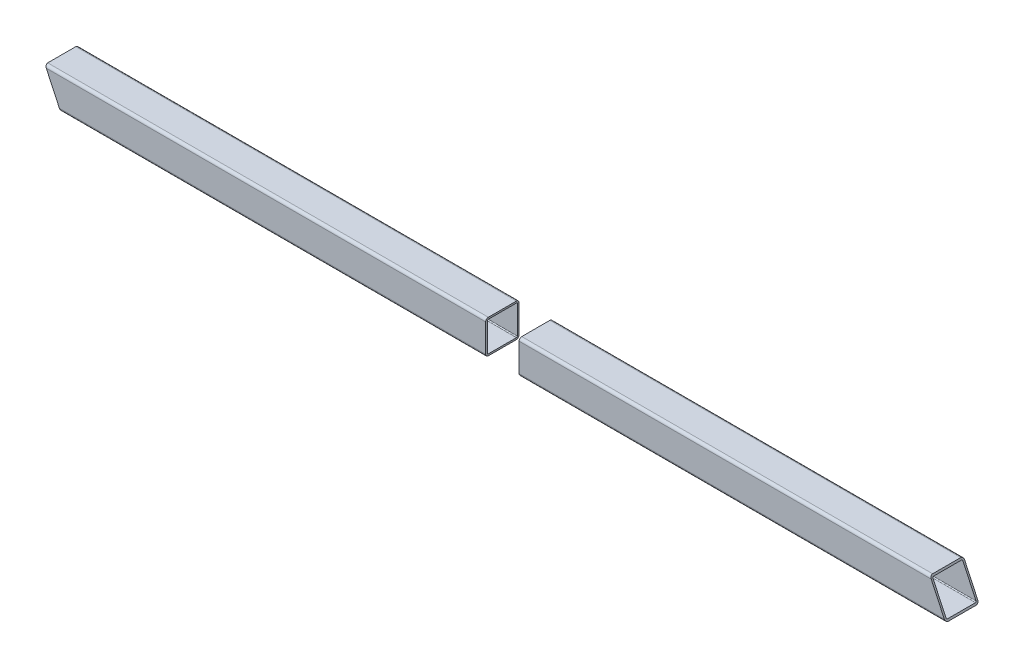
ISO-10303-21;
HEADER;
FILE_DESCRIPTION(('STEP AP214'),'2;1');
FILE_NAME('part.step','',(''),(''),'','','');
FILE_SCHEMA(('AUTOMOTIVE_DESIGN { 1 0 10303 214 1 1 1 1 }'));
ENDSEC;
DATA;
#1=APPLICATION_CONTEXT('core data for automotive mechanical design processes');
#2=APPLICATION_PROTOCOL_DEFINITION('international standard','automotive_design',2000,#1);
#3=PRODUCT_CONTEXT('',#1,'mechanical');
#4=PRODUCT('Part','Part','',(#3));
#5=PRODUCT_RELATED_PRODUCT_CATEGORY('part','',(#4));
#6=PRODUCT_DEFINITION_FORMATION('','',#4);
#7=PRODUCT_DEFINITION_CONTEXT('part definition',#1,'design');
#8=PRODUCT_DEFINITION('design','',#6,#7);
#9=PRODUCT_DEFINITION_SHAPE('','',#8);
#10=(LENGTH_UNIT() NAMED_UNIT(*) SI_UNIT(.MILLI.,.METRE.));
#11=(NAMED_UNIT(*) PLANE_ANGLE_UNIT() SI_UNIT($,.RADIAN.));
#12=(NAMED_UNIT(*) SI_UNIT($,.STERADIAN.) SOLID_ANGLE_UNIT());
#13=UNCERTAINTY_MEASURE_WITH_UNIT(LENGTH_MEASURE(1.E-05),#10,'distance_accuracy_value','');
#14=(GEOMETRIC_REPRESENTATION_CONTEXT(3) GLOBAL_UNCERTAINTY_ASSIGNED_CONTEXT((#13)) GLOBAL_UNIT_ASSIGNED_CONTEXT((#10,
#11,#12)) REPRESENTATION_CONTEXT('',''));
#15=CARTESIAN_POINT('',(0.,0.,0.));
#16=DIRECTION('',(0.,0.,1.));
#17=DIRECTION('',(1.,0.,0.));
#18=AXIS2_PLACEMENT_3D('',#15,#16,#17);
#19=CARTESIAN_POINT('',(393.7,10.1854,21.209));
#20=DIRECTION('',(0.,1.,0.));
#21=DIRECTION('',(0.,0.,1.));
#22=AXIS2_PLACEMENT_3D('',#19,#20,#21);
#23=PLANE('',#22);
#24=DIRECTION('',(0.,0.,1.));
#25=VECTOR('',#24,1.);
#26=CARTESIAN_POINT('',(341.923747380889,10.1854,21.209));
#27=LINE('',#26,#25);
#28=CARTESIAN_POINT('',(341.923747380889,10.1854,10.541));
#29=VERTEX_POINT('',#28);
#30=CARTESIAN_POINT('',(341.923747380889,10.1854,21.209));
#31=VERTEX_POINT('',#30);
#32=EDGE_CURVE('E226',#29,#31,#27,.T.);
#33=ORIENTED_EDGE('',*,*,#32,.F.);
#34=DIRECTION('',(-1.,0.,0.));
#35=VECTOR('',#34,1.);
#36=CARTESIAN_POINT('',(393.7,10.1854,10.541));
#37=LINE('',#36,#35);
#38=CARTESIAN_POINT('',(180.161106520746,10.1854,10.541));
#39=VERTEX_POINT('',#38);
#40=EDGE_CURVE('E62',#29,#39,#37,.T.);
#41=ORIENTED_EDGE('',*,*,#40,.T.);
#42=DIRECTION('',(0.,0.,-1.));
#43=VECTOR('',#42,1.);
#44=CARTESIAN_POINT('',(180.161106520746,10.1854,21.209));
#45=LINE('',#44,#43);
#46=CARTESIAN_POINT('',(180.161106520746,10.1854,21.209));
#47=VERTEX_POINT('',#46);
#48=EDGE_CURVE('E223',#47,#39,#45,.T.);
#49=ORIENTED_EDGE('',*,*,#48,.F.);
#50=DIRECTION('',(-1.,0.,0.));
#51=VECTOR('',#50,1.);
#52=CARTESIAN_POINT('',(393.7,10.1854,21.209));
#53=LINE('',#52,#51);
#54=EDGE_CURVE('E212',#31,#47,#53,.T.);
#55=ORIENTED_EDGE('',*,*,#54,.F.);
#56=EDGE_LOOP('',(#33,#41,#49,#55));
#57=FACE_BOUND('',#56,.T.);
#58=ADVANCED_FACE('F58',(#57),#23,.T.);
#59=CARTESIAN_POINT('',(393.7,10.541,21.209));
#60=DIRECTION('',(-1.,0.,0.));
#61=DIRECTION('',(0.,-1.,0.));
#62=AXIS2_PLACEMENT_3D('',#59,#60,#61);
#63=CYLINDRICAL_SURFACE('',#62,0.355600000000001);
#64=CARTESIAN_POINT('',(341.757928377651,10.5409999999959,21.209));
#65=DIRECTION('',(-0.906307787036652,-0.422618261740695,0.));
#66=DIRECTION('',(-0.422618261740695,0.906307787036652,0.));
#67=AXIS2_PLACEMENT_3D('',#64,#65,#66);
#68=ELLIPSE('',#67,0.392361187983048,0.355600000000001);
#69=CARTESIAN_POINT('',(341.757928377649,10.541,21.5646));
#70=VERTEX_POINT('',#69);
#71=EDGE_CURVE('E255',#31,#70,#68,.T.);
#72=ORIENTED_EDGE('',*,*,#71,.F.);
#73=ORIENTED_EDGE('',*,*,#54,.T.);
#74=CARTESIAN_POINT('',(180.161106520746,10.5409999999833,21.209));
#75=DIRECTION('',(1.,0.,0.));
#76=DIRECTION('',(0.,0.,-1.));
#77=AXIS2_PLACEMENT_3D('',#74,#75,#76);
#78=CIRCLE('',#77,0.355600000000001);
#79=CARTESIAN_POINT('',(180.161106520746,10.541,21.5646));
#80=VERTEX_POINT('',#79);
#81=EDGE_CURVE('E269',#80,#47,#78,.T.);
#82=ORIENTED_EDGE('',*,*,#81,.F.);
#83=DIRECTION('',(-1.,0.,0.));
#84=VECTOR('',#83,1.);
#85=CARTESIAN_POINT('',(393.7,10.541,21.5646));
#86=LINE('',#85,#84);
#87=EDGE_CURVE('E210',#70,#80,#86,.T.);
#88=ORIENTED_EDGE('',*,*,#87,.F.);
#89=EDGE_LOOP('',(#72,#73,#82,#88));
#90=FACE_BOUND('',#89,.T.);
#91=ADVANCED_FACE('F268',(#90),#63,.F.);
#92=CARTESIAN_POINT('',(393.7,21.209,21.5646));
#93=DIRECTION('',(0.,0.,-1.));
#94=DIRECTION('',(-1.,0.,0.));
#95=AXIS2_PLACEMENT_3D('',#92,#93,#94);
#96=PLANE('',#95);
#97=DIRECTION('',(-0.422618261740695,0.906307787036652,0.));
#98=VECTOR('',#97,1.);
#99=CARTESIAN_POINT('',(346.949023099079,-0.591338555126605,21.5646));
#100=LINE('',#99,#98);
#101=CARTESIAN_POINT('',(336.783358280452,21.209,21.5646));
#102=VERTEX_POINT('',#101);
#103=EDGE_CURVE('E258',#70,#102,#100,.T.);
#104=ORIENTED_EDGE('',*,*,#103,.F.);
#105=ORIENTED_EDGE('',*,*,#87,.T.);
#106=DIRECTION('',(0.,-1.,0.));
#107=VECTOR('',#106,1.);
#108=CARTESIAN_POINT('',(180.161106520746,21.209,21.5646));
#109=LINE('',#108,#107);
#110=CARTESIAN_POINT('',(180.161106520746,21.209,21.5646));
#111=VERTEX_POINT('',#110);
#112=EDGE_CURVE('E271',#111,#80,#109,.T.);
#113=ORIENTED_EDGE('',*,*,#112,.F.);
#114=DIRECTION('',(-1.,0.,0.));
#115=VECTOR('',#114,1.);
#116=CARTESIAN_POINT('',(393.7,21.209,21.5646));
#117=LINE('',#116,#115);
#118=EDGE_CURVE('E207',#102,#111,#117,.T.);
#119=ORIENTED_EDGE('',*,*,#118,.F.);
#120=EDGE_LOOP('',(#104,#105,#113,#119));
#121=FACE_BOUND('',#120,.T.);
#122=ADVANCED_FACE('F264',(#121),#96,.T.);
#123=CARTESIAN_POINT('',(393.7,21.209,21.209));
#124=DIRECTION('',(-1.,0.,0.));
#125=DIRECTION('',(0.,-1.,0.));
#126=AXIS2_PLACEMENT_3D('',#123,#124,#125);
#127=CYLINDRICAL_SURFACE('',#126,0.355600000000003);
#128=CARTESIAN_POINT('',(336.783358280454,21.2089999999956,21.209));
#129=DIRECTION('',(-0.906307787036652,-0.422618261740695,0.));
#130=DIRECTION('',(-0.422618261740695,0.906307787036652,0.));
#131=AXIS2_PLACEMENT_3D('',#128,#129,#130);
#132=ELLIPSE('',#131,0.39236118798305,0.355600000000003);
#133=CARTESIAN_POINT('',(336.617539277212,21.5646,21.209));
#134=VERTEX_POINT('',#133);
#135=EDGE_CURVE('E266',#102,#134,#132,.T.);
#136=ORIENTED_EDGE('',*,*,#135,.F.);
#137=ORIENTED_EDGE('',*,*,#118,.T.);
#138=CARTESIAN_POINT('',(180.161106520746,21.2089999999833,21.209));
#139=DIRECTION('',(1.,0.,0.));
#140=DIRECTION('',(0.,0.,-1.));
#141=AXIS2_PLACEMENT_3D('',#138,#139,#140);
#142=CIRCLE('',#141,0.355600000000003);
#143=CARTESIAN_POINT('',(180.161106520746,21.5645999999833,21.209));
#144=VERTEX_POINT('',#143);
#145=EDGE_CURVE('E274',#144,#111,#142,.T.);
#146=ORIENTED_EDGE('',*,*,#145,.F.);
#147=DIRECTION('',(-1.,0.,0.));
#148=VECTOR('',#147,1.);
#149=CARTESIAN_POINT('',(393.7,21.5646,21.209));
#150=LINE('',#149,#148);
#151=EDGE_CURVE('E204',#134,#144,#150,.T.);
#152=ORIENTED_EDGE('',*,*,#151,.F.);
#153=EDGE_LOOP('',(#136,#137,#146,#152));
#154=FACE_BOUND('',#153,.T.);
#155=ADVANCED_FACE('F319',(#154),#127,.F.);
#156=CARTESIAN_POINT('',(393.7,21.5646,10.541));
#157=DIRECTION('',(0.,-1.,0.));
#158=DIRECTION('',(0.,0.,-1.));
#159=AXIS2_PLACEMENT_3D('',#156,#157,#158);
#160=PLANE('',#159);
#161=DIRECTION('',(0.,0.,-1.));
#162=VECTOR('',#161,1.);
#163=CARTESIAN_POINT('',(336.617539277212,21.5646,10.541));
#164=LINE('',#163,#162);
#165=CARTESIAN_POINT('',(336.617539277212,21.5646,10.541));
#166=VERTEX_POINT('',#165);
#167=EDGE_CURVE('E302',#134,#166,#164,.T.);
#168=ORIENTED_EDGE('',*,*,#167,.F.);
#169=ORIENTED_EDGE('',*,*,#151,.T.);
#170=DIRECTION('',(0.,0.,1.));
#171=VECTOR('',#170,1.);
#172=CARTESIAN_POINT('',(180.161106520746,21.5646,10.541));
#173=LINE('',#172,#171);
#174=CARTESIAN_POINT('',(180.161106520746,21.5646,10.541));
#175=VERTEX_POINT('',#174);
#176=EDGE_CURVE('E314',#175,#144,#173,.T.);
#177=ORIENTED_EDGE('',*,*,#176,.F.);
#178=DIRECTION('',(-1.,0.,0.));
#179=VECTOR('',#178,1.);
#180=CARTESIAN_POINT('',(393.7,21.5646,10.541));
#181=LINE('',#180,#179);
#182=EDGE_CURVE('E201',#166,#175,#181,.T.);
#183=ORIENTED_EDGE('',*,*,#182,.F.);
#184=EDGE_LOOP('',(#168,#169,#177,#183));
#185=FACE_BOUND('',#184,.T.);
#186=ADVANCED_FACE('F324',(#185),#160,.T.);
#187=CARTESIAN_POINT('',(393.7,21.209,10.541));
#188=DIRECTION('',(-1.,0.,0.));
#189=DIRECTION('',(0.,-1.,0.));
#190=AXIS2_PLACEMENT_3D('',#187,#188,#189);
#191=CYLINDRICAL_SURFACE('',#190,0.3556);
#192=CARTESIAN_POINT('',(336.783358280454,21.2089999999956,10.541));
#193=DIRECTION('',(-0.906307787036652,-0.422618261740695,0.));
#194=DIRECTION('',(-0.422618261740695,0.906307787036652,0.));
#195=AXIS2_PLACEMENT_3D('',#192,#193,#194);
#196=ELLIPSE('',#195,0.392361187983047,0.3556);
#197=CARTESIAN_POINT('',(336.783358280452,21.209,10.1854));
#198=VERTEX_POINT('',#197);
#199=EDGE_CURVE('E300',#166,#198,#196,.T.);
#200=ORIENTED_EDGE('',*,*,#199,.F.);
#201=ORIENTED_EDGE('',*,*,#182,.T.);
#202=CARTESIAN_POINT('',(180.161106520746,21.2089999999833,10.541));
#203=DIRECTION('',(1.,0.,0.));
#204=DIRECTION('',(0.,0.,-1.));
#205=AXIS2_PLACEMENT_3D('',#202,#203,#204);
#206=CIRCLE('',#205,0.3556);
#207=CARTESIAN_POINT('',(180.161106520746,21.2089999999833,10.1854));
#208=VERTEX_POINT('',#207);
#209=EDGE_CURVE('E312',#208,#175,#206,.T.);
#210=ORIENTED_EDGE('',*,*,#209,.F.);
#211=DIRECTION('',(-1.,0.,0.));
#212=VECTOR('',#211,1.);
#213=CARTESIAN_POINT('',(393.7,21.209,10.1854));
#214=LINE('',#213,#212);
#215=EDGE_CURVE('E198',#198,#208,#214,.T.);
#216=ORIENTED_EDGE('',*,*,#215,.F.);
#217=EDGE_LOOP('',(#200,#201,#210,#216));
#218=FACE_BOUND('',#217,.T.);
#219=ADVANCED_FACE('F327',(#218),#191,.F.);
#220=CARTESIAN_POINT('',(393.7,10.541,10.1854));
#221=DIRECTION('',(0.,0.,1.));
#222=DIRECTION('',(1.,0.,0.));
#223=AXIS2_PLACEMENT_3D('',#220,#221,#222);
#224=PLANE('',#223);
#225=DIRECTION('',(0.422618261740695,-0.906307787036652,0.));
#226=VECTOR('',#225,1.);
#227=CARTESIAN_POINT('',(351.035104158676,-9.35396766519464,10.1854));
#228=LINE('',#227,#226);
#229=CARTESIAN_POINT('',(341.757928377649,10.541,10.1854));
#230=VERTEX_POINT('',#229);
#231=EDGE_CURVE('E287',#198,#230,#228,.T.);
#232=ORIENTED_EDGE('',*,*,#231,.F.);
#233=ORIENTED_EDGE('',*,*,#215,.T.);
#234=DIRECTION('',(0.,1.,0.));
#235=VECTOR('',#234,1.);
#236=CARTESIAN_POINT('',(180.161106520746,10.541,10.1854));
#237=LINE('',#236,#235);
#238=CARTESIAN_POINT('',(180.161106520746,10.541,10.1854));
#239=VERTEX_POINT('',#238);
#240=EDGE_CURVE('E310',#239,#208,#237,.T.);
#241=ORIENTED_EDGE('',*,*,#240,.F.);
#242=DIRECTION('',(-1.,0.,0.));
#243=VECTOR('',#242,1.);
#244=CARTESIAN_POINT('',(393.7,10.541,10.1854));
#245=LINE('',#244,#243);
#246=EDGE_CURVE('E194',#230,#239,#245,.T.);
#247=ORIENTED_EDGE('',*,*,#246,.F.);
#248=EDGE_LOOP('',(#232,#233,#241,#247));
#249=FACE_BOUND('',#248,.T.);
#250=ADVANCED_FACE('F331',(#249),#224,.T.);
#251=CARTESIAN_POINT('',(393.7,10.541,10.541));
#252=DIRECTION('',(-1.,0.,0.));
#253=DIRECTION('',(0.,-1.,0.));
#254=AXIS2_PLACEMENT_3D('',#251,#252,#253);
#255=CYLINDRICAL_SURFACE('',#254,0.3556);
#256=CARTESIAN_POINT('',(341.757928377651,10.5409999999959,10.541));
#257=DIRECTION('',(-0.906307787036652,-0.422618261740695,0.));
#258=DIRECTION('',(-0.422618261740695,0.906307787036652,0.));
#259=AXIS2_PLACEMENT_3D('',#256,#257,#258);
#260=ELLIPSE('',#259,0.392361187983047,0.3556);
#261=EDGE_CURVE('E162',#230,#29,#260,.T.);
#262=ORIENTED_EDGE('',*,*,#261,.F.);
#263=ORIENTED_EDGE('',*,*,#246,.T.);
#264=CARTESIAN_POINT('',(180.161106520746,10.5409999999833,10.541));
#265=DIRECTION('',(1.,0.,0.));
#266=DIRECTION('',(0.,0.,-1.));
#267=AXIS2_PLACEMENT_3D('',#264,#265,#266);
#268=CIRCLE('',#267,0.3556);
#269=EDGE_CURVE('E197',#39,#239,#268,.T.);
#270=ORIENTED_EDGE('',*,*,#269,.F.);
#271=ORIENTED_EDGE('',*,*,#40,.F.);
#272=EDGE_LOOP('',(#262,#263,#270,#271));
#273=FACE_BOUND('',#272,.T.);
#274=ADVANCED_FACE('F230',(#273),#255,.F.);
#275=CARTESIAN_POINT('',(180.161106520746,22.225,9.525));
#276=DIRECTION('',(1.,0.,0.));
#277=DIRECTION('',(0.,0.,-1.));
#278=AXIS2_PLACEMENT_3D('',#275,#276,#277);
#279=PLANE('',#278);
#280=ORIENTED_EDGE('',*,*,#269,.T.);
#281=ORIENTED_EDGE('',*,*,#240,.T.);
#282=ORIENTED_EDGE('',*,*,#209,.T.);
#283=ORIENTED_EDGE('',*,*,#176,.T.);
#284=ORIENTED_EDGE('',*,*,#145,.T.);
#285=ORIENTED_EDGE('',*,*,#112,.T.);
#286=ORIENTED_EDGE('',*,*,#81,.T.);
#287=ORIENTED_EDGE('',*,*,#48,.T.);
#288=EDGE_LOOP('',(#280,#281,#282,#283,#284,#285,#286,#287));
#289=FACE_BOUND('',#288,.T.);
#290=DIRECTION('',(0.,1.,0.));
#291=VECTOR('',#290,1.);
#292=CARTESIAN_POINT('',(180.161106520746,22.225,22.225));
#293=LINE('',#292,#291);
#294=CARTESIAN_POINT('',(180.161106520746,10.541,22.225));
#295=VERTEX_POINT('',#294);
#296=CARTESIAN_POINT('',(180.161106520746,21.209,22.225));
#297=VERTEX_POINT('',#296);
#298=EDGE_CURVE('E163',#295,#297,#293,.T.);
#299=ORIENTED_EDGE('',*,*,#298,.T.);
#300=CARTESIAN_POINT('',(180.161106520746,21.2089999999942,21.209));
#301=DIRECTION('',(1.,0.,0.));
#302=DIRECTION('',(0.,0.,-1.));
#303=AXIS2_PLACEMENT_3D('',#300,#301,#302);
#304=CIRCLE('',#303,1.016);
#305=CARTESIAN_POINT('',(180.161106520746,22.225,21.209));
#306=VERTEX_POINT('',#305);
#307=EDGE_CURVE('E185',#306,#297,#304,.T.);
#308=ORIENTED_EDGE('',*,*,#307,.F.);
#309=DIRECTION('',(0.,0.,1.));
#310=VECTOR('',#309,1.);
#311=CARTESIAN_POINT('',(180.161106520746,22.225,9.525));
#312=LINE('',#311,#310);
#313=CARTESIAN_POINT('',(180.161106520746,22.225,10.541));
#314=VERTEX_POINT('',#313);
#315=EDGE_CURVE('E184',#314,#306,#312,.T.);
#316=ORIENTED_EDGE('',*,*,#315,.F.);
#317=CARTESIAN_POINT('',(180.161106520746,21.2089999999942,10.541));
#318=DIRECTION('',(1.,0.,0.));
#319=DIRECTION('',(0.,0.,-1.));
#320=AXIS2_PLACEMENT_3D('',#317,#318,#319);
#321=CIRCLE('',#320,1.016);
#322=CARTESIAN_POINT('',(180.161106520746,21.208999999994,9.525));
#323=VERTEX_POINT('',#322);
#324=EDGE_CURVE('E179',#323,#314,#321,.T.);
#325=ORIENTED_EDGE('',*,*,#324,.F.);
#326=DIRECTION('',(0.,1.,0.));
#327=VECTOR('',#326,1.);
#328=CARTESIAN_POINT('',(180.161106520746,22.225,9.525));
#329=LINE('',#328,#327);
#330=CARTESIAN_POINT('',(180.161106520746,10.541,9.525));
#331=VERTEX_POINT('',#330);
#332=EDGE_CURVE('E148',#331,#323,#329,.T.);
#333=ORIENTED_EDGE('',*,*,#332,.F.);
#334=CARTESIAN_POINT('',(180.161106520746,10.5409999999942,10.541));
#335=DIRECTION('',(1.,0.,0.));
#336=DIRECTION('',(0.,0.,-1.));
#337=AXIS2_PLACEMENT_3D('',#334,#335,#336);
#338=CIRCLE('',#337,1.016);
#339=CARTESIAN_POINT('',(180.161106520746,9.52500000000006,10.541));
#340=VERTEX_POINT('',#339);
#341=EDGE_CURVE('E141',#340,#331,#338,.T.);
#342=ORIENTED_EDGE('',*,*,#341,.F.);
#343=DIRECTION('',(0.,0.,1.));
#344=VECTOR('',#343,1.);
#345=CARTESIAN_POINT('',(180.161106520746,9.52500000000006,9.525));
#346=LINE('',#345,#344);
#347=CARTESIAN_POINT('',(180.161106520746,9.52500000000006,21.209));
#348=VERTEX_POINT('',#347);
#349=EDGE_CURVE('E146',#340,#348,#346,.T.);
#350=ORIENTED_EDGE('',*,*,#349,.T.);
#351=CARTESIAN_POINT('',(180.161106520746,10.5409999999942,21.209));
#352=DIRECTION('',(1.,0.,0.));
#353=DIRECTION('',(0.,0.,-1.));
#354=AXIS2_PLACEMENT_3D('',#351,#352,#353);
#355=CIRCLE('',#354,1.016);
#356=EDGE_CURVE('E12',#295,#348,#355,.T.);
#357=ORIENTED_EDGE('',*,*,#356,.F.);
#358=EDGE_LOOP('',(#299,#308,#316,#325,#333,#342,#350,#357));
#359=FACE_BOUND('',#358,.T.);
#360=ADVANCED_FACE('F144',(#289,#359),#279,.F.);
#361=CARTESIAN_POINT('',(336.309589699766,22.225,9.525));
#362=DIRECTION('',(-0.906307787036652,-0.422618261740695,0.));
#363=DIRECTION('',(0.422618261740695,-0.906307787036652,0.));
#364=AXIS2_PLACEMENT_3D('',#361,#362,#363);
#365=PLANE('',#364);
#366=ORIENTED_EDGE('',*,*,#261,.T.);
#367=ORIENTED_EDGE('',*,*,#32,.T.);
#368=ORIENTED_EDGE('',*,*,#71,.T.);
#369=ORIENTED_EDGE('',*,*,#103,.T.);
#370=ORIENTED_EDGE('',*,*,#135,.T.);
#371=ORIENTED_EDGE('',*,*,#167,.T.);
#372=ORIENTED_EDGE('',*,*,#199,.T.);
#373=ORIENTED_EDGE('',*,*,#231,.T.);
#374=EDGE_LOOP('',(#366,#367,#368,#369,#370,#371,#372,#373));
#375=FACE_BOUND('',#374,.T.);
#376=DIRECTION('',(0.,0.,1.));
#377=VECTOR('',#376,1.);
#378=CARTESIAN_POINT('',(342.231696958335,9.525,9.525));
#379=LINE('',#378,#377);
#380=CARTESIAN_POINT('',(342.231696958336,9.52499999999859,10.541));
#381=VERTEX_POINT('',#380);
#382=CARTESIAN_POINT('',(342.231696958335,9.525,21.209));
#383=VERTEX_POINT('',#382);
#384=EDGE_CURVE('E153',#381,#383,#379,.T.);
#385=ORIENTED_EDGE('',*,*,#384,.F.);
#386=CARTESIAN_POINT('',(341.75792837765,10.5409999999986,10.541));
#387=DIRECTION('',(-0.906307787036652,-0.422618261740695,0.));
#388=DIRECTION('',(-0.422618261740695,0.906307787036652,0.));
#389=AXIS2_PLACEMENT_3D('',#386,#387,#388);
#390=ELLIPSE('',#389,1.12103196566587,1.016);
#391=CARTESIAN_POINT('',(341.757928377649,10.541,9.525));
#392=VERTEX_POINT('',#391);
#393=EDGE_CURVE('E167',#392,#381,#390,.T.);
#394=ORIENTED_EDGE('',*,*,#393,.F.);
#395=DIRECTION('',(0.422618261740695,-0.906307787036652,0.));
#396=VECTOR('',#395,1.);
#397=CARTESIAN_POINT('',(336.309589699766,22.225,9.525));
#398=LINE('',#397,#396);
#399=CARTESIAN_POINT('',(336.783358280453,21.2089999999984,9.525));
#400=VERTEX_POINT('',#399);
#401=EDGE_CURVE('E175',#400,#392,#398,.T.);
#402=ORIENTED_EDGE('',*,*,#401,.F.);
#403=CARTESIAN_POINT('',(336.783358280453,21.2089999999984,10.541));
#404=DIRECTION('',(-0.906307787036652,-0.422618261740695,0.));
#405=DIRECTION('',(-0.422618261740695,0.906307787036652,0.));
#406=AXIS2_PLACEMENT_3D('',#403,#404,#405);
#407=ELLIPSE('',#406,1.12103196566587,1.016);
#408=CARTESIAN_POINT('',(336.309589699766,22.225,10.541));
#409=VERTEX_POINT('',#408);
#410=EDGE_CURVE('E180',#409,#400,#407,.T.);
#411=ORIENTED_EDGE('',*,*,#410,.F.);
#412=DIRECTION('',(0.,0.,1.));
#413=VECTOR('',#412,1.);
#414=CARTESIAN_POINT('',(336.309589699766,22.225,9.525));
#415=LINE('',#414,#413);
#416=CARTESIAN_POINT('',(336.309589699767,22.2249999999984,21.209));
#417=VERTEX_POINT('',#416);
#418=EDGE_CURVE('E285',#409,#417,#415,.T.);
#419=ORIENTED_EDGE('',*,*,#418,.T.);
#420=CARTESIAN_POINT('',(336.783358280453,21.2089999999984,21.209));
#421=DIRECTION('',(-0.906307787036652,-0.422618261740695,0.));
#422=DIRECTION('',(-0.422618261740695,0.906307787036652,0.));
#423=AXIS2_PLACEMENT_3D('',#420,#421,#422);
#424=ELLIPSE('',#423,1.12103196566588,1.016);
#425=CARTESIAN_POINT('',(336.783358280452,21.209,22.225));
#426=VERTEX_POINT('',#425);
#427=EDGE_CURVE('E189',#426,#417,#424,.T.);
#428=ORIENTED_EDGE('',*,*,#427,.F.);
#429=DIRECTION('',(0.422618261740695,-0.906307787036652,0.));
#430=VECTOR('',#429,1.);
#431=CARTESIAN_POINT('',(336.309589699766,22.225,22.225));
#432=LINE('',#431,#430);
#433=CARTESIAN_POINT('',(341.757928377649,10.541,22.225));
#434=VERTEX_POINT('',#433);
#435=EDGE_CURVE('E193',#426,#434,#432,.T.);
#436=ORIENTED_EDGE('',*,*,#435,.T.);
#437=CARTESIAN_POINT('',(341.75792837765,10.5409999999986,21.209));
#438=DIRECTION('',(-0.906307787036652,-0.422618261740695,0.));
#439=DIRECTION('',(-0.422618261740695,0.906307787036652,0.));
#440=AXIS2_PLACEMENT_3D('',#437,#438,#439);
#441=ELLIPSE('',#440,1.12103196566587,1.016);
#442=EDGE_CURVE('E77',#383,#434,#441,.T.);
#443=ORIENTED_EDGE('',*,*,#442,.F.);
#444=EDGE_LOOP('',(#385,#394,#402,#411,#419,#428,#436,#443));
#445=FACE_BOUND('',#444,.T.);
#446=ADVANCED_FACE('F257',(#375,#445),#365,.F.);
#447=CARTESIAN_POINT('',(393.7,21.209,22.225));
#448=DIRECTION('',(0.,0.,-1.));
#449=DIRECTION('',(0.,1.,0.));
#450=AXIS2_PLACEMENT_3D('',#447,#448,#449);
#451=PLANE('',#450);
#452=DIRECTION('',(-1.,0.,0.));
#453=VECTOR('',#452,1.);
#454=CARTESIAN_POINT('',(393.7,10.541,22.225));
#455=LINE('',#454,#453);
#456=EDGE_CURVE('E68',#434,#295,#455,.T.);
#457=ORIENTED_EDGE('',*,*,#456,.F.);
#458=ORIENTED_EDGE('',*,*,#435,.F.);
#459=DIRECTION('',(-1.,0.,0.));
#460=VECTOR('',#459,1.);
#461=CARTESIAN_POINT('',(393.7,21.209,22.225));
#462=LINE('',#461,#460);
#463=EDGE_CURVE('E190',#426,#297,#462,.T.);
#464=ORIENTED_EDGE('',*,*,#463,.T.);
#465=ORIENTED_EDGE('',*,*,#298,.F.);
#466=EDGE_LOOP('',(#457,#458,#464,#465));
#467=FACE_BOUND('',#466,.T.);
#468=ADVANCED_FACE('F381',(#467),#451,.F.);
#469=CARTESIAN_POINT('',(393.7,21.209,21.209));
#470=DIRECTION('',(-1.,0.,0.));
#471=DIRECTION('',(0.,-1.,0.));
#472=AXIS2_PLACEMENT_3D('',#469,#470,#471);
#473=CYLINDRICAL_SURFACE('',#472,1.016);
#474=ORIENTED_EDGE('',*,*,#463,.F.);
#475=ORIENTED_EDGE('',*,*,#427,.T.);
#476=DIRECTION('',(-1.,0.,0.));
#477=VECTOR('',#476,1.);
#478=CARTESIAN_POINT('',(393.7,22.225,21.209));
#479=LINE('',#478,#477);
#480=EDGE_CURVE('E186',#417,#306,#479,.T.);
#481=ORIENTED_EDGE('',*,*,#480,.T.);
#482=ORIENTED_EDGE('',*,*,#307,.T.);
#483=EDGE_LOOP('',(#474,#475,#481,#482));
#484=FACE_BOUND('',#483,.T.);
#485=ADVANCED_FACE('F386',(#484),#473,.T.);
#486=CARTESIAN_POINT('',(393.7,22.225,10.541));
#487=DIRECTION('',(0.,-1.,0.));
#488=DIRECTION('',(0.,0.,-1.));
#489=AXIS2_PLACEMENT_3D('',#486,#487,#488);
#490=PLANE('',#489);
#491=ORIENTED_EDGE('',*,*,#480,.F.);
#492=ORIENTED_EDGE('',*,*,#418,.F.);
#493=DIRECTION('',(-1.,0.,0.));
#494=VECTOR('',#493,1.);
#495=CARTESIAN_POINT('',(393.7,22.225,10.541));
#496=LINE('',#495,#494);
#497=EDGE_CURVE('E181',#409,#314,#496,.T.);
#498=ORIENTED_EDGE('',*,*,#497,.T.);
#499=ORIENTED_EDGE('',*,*,#315,.T.);
#500=EDGE_LOOP('',(#491,#492,#498,#499));
#501=FACE_BOUND('',#500,.T.);
#502=ADVANCED_FACE('F397',(#501),#490,.F.);
#503=CARTESIAN_POINT('',(393.7,21.209,10.541));
#504=DIRECTION('',(-1.,0.,0.));
#505=DIRECTION('',(0.,-1.,0.));
#506=AXIS2_PLACEMENT_3D('',#503,#504,#505);
#507=CYLINDRICAL_SURFACE('',#506,1.016);
#508=ORIENTED_EDGE('',*,*,#497,.F.);
#509=ORIENTED_EDGE('',*,*,#410,.T.);
#510=DIRECTION('',(-1.,0.,0.));
#511=VECTOR('',#510,1.);
#512=CARTESIAN_POINT('',(393.7,21.209,9.525));
#513=LINE('',#512,#511);
#514=EDGE_CURVE('E176',#400,#323,#513,.T.);
#515=ORIENTED_EDGE('',*,*,#514,.T.);
#516=ORIENTED_EDGE('',*,*,#324,.T.);
#517=EDGE_LOOP('',(#508,#509,#515,#516));
#518=FACE_BOUND('',#517,.T.);
#519=ADVANCED_FACE('F407',(#518),#507,.T.);
#520=CARTESIAN_POINT('',(393.7,10.541,9.525));
#521=DIRECTION('',(0.,0.,1.));
#522=DIRECTION('',(1.,0.,0.));
#523=AXIS2_PLACEMENT_3D('',#520,#521,#522);
#524=PLANE('',#523);
#525=ORIENTED_EDGE('',*,*,#514,.F.);
#526=ORIENTED_EDGE('',*,*,#401,.T.);
#527=DIRECTION('',(-1.,0.,0.));
#528=VECTOR('',#527,1.);
#529=CARTESIAN_POINT('',(393.7,10.541,9.525));
#530=LINE('',#529,#528);
#531=EDGE_CURVE('E173',#392,#331,#530,.T.);
#532=ORIENTED_EDGE('',*,*,#531,.T.);
#533=ORIENTED_EDGE('',*,*,#332,.T.);
#534=EDGE_LOOP('',(#525,#526,#532,#533));
#535=FACE_BOUND('',#534,.T.);
#536=ADVANCED_FACE('F417',(#535),#524,.F.);
#537=CARTESIAN_POINT('',(393.7,10.541,10.541));
#538=DIRECTION('',(-1.,0.,0.));
#539=DIRECTION('',(0.,-1.,0.));
#540=AXIS2_PLACEMENT_3D('',#537,#538,#539);
#541=CYLINDRICAL_SURFACE('',#540,1.016);
#542=ORIENTED_EDGE('',*,*,#531,.F.);
#543=ORIENTED_EDGE('',*,*,#393,.T.);
#544=DIRECTION('',(-1.,0.,0.));
#545=VECTOR('',#544,1.);
#546=CARTESIAN_POINT('',(393.7,9.525,10.541));
#547=LINE('',#546,#545);
#548=EDGE_CURVE('E154',#381,#340,#547,.T.);
#549=ORIENTED_EDGE('',*,*,#548,.T.);
#550=ORIENTED_EDGE('',*,*,#341,.T.);
#551=EDGE_LOOP('',(#542,#543,#549,#550));
#552=FACE_BOUND('',#551,.T.);
#553=ADVANCED_FACE('F166',(#552),#541,.T.);
#554=CARTESIAN_POINT('',(393.7,9.525,21.209));
#555=DIRECTION('',(0.,1.,0.));
#556=DIRECTION('',(0.,0.,1.));
#557=AXIS2_PLACEMENT_3D('',#554,#555,#556);
#558=PLANE('',#557);
#559=ORIENTED_EDGE('',*,*,#548,.F.);
#560=ORIENTED_EDGE('',*,*,#384,.T.);
#561=DIRECTION('',(-1.,0.,0.));
#562=VECTOR('',#561,1.);
#563=CARTESIAN_POINT('',(393.7,9.525,21.209));
#564=LINE('',#563,#562);
#565=EDGE_CURVE('E161',#383,#348,#564,.T.);
#566=ORIENTED_EDGE('',*,*,#565,.T.);
#567=ORIENTED_EDGE('',*,*,#349,.F.);
#568=EDGE_LOOP('',(#559,#560,#566,#567));
#569=FACE_BOUND('',#568,.T.);
#570=ADVANCED_FACE('F159',(#569),#558,.F.);
#571=CARTESIAN_POINT('',(393.7,10.541,21.209));
#572=DIRECTION('',(-1.,0.,0.));
#573=DIRECTION('',(0.,-1.,0.));
#574=AXIS2_PLACEMENT_3D('',#571,#572,#573);
#575=CYLINDRICAL_SURFACE('',#574,1.016);
#576=ORIENTED_EDGE('',*,*,#565,.F.);
#577=ORIENTED_EDGE('',*,*,#442,.T.);
#578=ORIENTED_EDGE('',*,*,#456,.T.);
#579=ORIENTED_EDGE('',*,*,#356,.T.);
#580=EDGE_LOOP('',(#576,#577,#578,#579));
#581=FACE_BOUND('',#580,.T.);
#582=ADVANCED_FACE('F60',(#581),#575,.T.);
#583=CLOSED_SHELL('',(#58,#91,#122,#155,#186,#219,#250,#274,#360,#446,#468,#485,#502,#519,#536,
#553,#570,#582));
#584=MANIFOLD_SOLID_BREP('B2',#583);
#585=CARTESIAN_POINT('',(393.7,10.1854,21.209));
#586=DIRECTION('',(0.,1.,0.));
#587=DIRECTION('',(0.,0.,1.));
#588=AXIS2_PLACEMENT_3D('',#585,#586,#587);
#589=PLANE('',#588);
#590=DIRECTION('',(0.,0.,-1.));
#591=VECTOR('',#590,1.);
#592=CARTESIAN_POINT('',(5.61415768112283,10.1854,21.209));
#593=LINE('',#592,#591);
#594=CARTESIAN_POINT('',(5.61415768112283,10.1854,21.209));
#595=VERTEX_POINT('',#594);
#596=CARTESIAN_POINT('',(5.61415768112283,10.1854,10.541));
#597=VERTEX_POINT('',#596);
#598=EDGE_CURVE('E56',#595,#597,#593,.T.);
#599=ORIENTED_EDGE('',*,*,#598,.F.);
#600=DIRECTION('',(-1.,0.,0.));
#601=VECTOR('',#600,1.);
#602=CARTESIAN_POINT('',(393.7,10.1854,21.209));
#603=LINE('',#602,#601);
#604=CARTESIAN_POINT('',(167.461106520746,10.1854,21.209));
#605=VERTEX_POINT('',#604);
#606=EDGE_CURVE('E654',#605,#595,#603,.T.);
#607=ORIENTED_EDGE('',*,*,#606,.F.);
#608=DIRECTION('',(0.,0.,1.));
#609=VECTOR('',#608,1.);
#610=CARTESIAN_POINT('',(167.461106520746,10.1854,21.209));
#611=LINE('',#610,#609);
#612=CARTESIAN_POINT('',(167.461106520746,10.1854,10.541));
#613=VERTEX_POINT('',#612);
#614=EDGE_CURVE('E502',#613,#605,#611,.T.);
#615=ORIENTED_EDGE('',*,*,#614,.F.);
#616=DIRECTION('',(-1.,0.,0.));
#617=VECTOR('',#616,1.);
#618=CARTESIAN_POINT('',(393.7,10.1854,10.541));
#619=LINE('',#618,#617);
#620=EDGE_CURVE('E651',#613,#597,#619,.T.);
#621=ORIENTED_EDGE('',*,*,#620,.T.);
#622=EDGE_LOOP('',(#599,#607,#615,#621));
#623=FACE_BOUND('',#622,.T.);
#624=ADVANCED_FACE('F495',(#623),#589,.T.);
#625=CARTESIAN_POINT('',(393.7,10.541,21.209));
#626=DIRECTION('',(-1.,0.,0.));
#627=DIRECTION('',(0.,-1.,0.));
#628=AXIS2_PLACEMENT_3D('',#625,#626,#627);
#629=CYLINDRICAL_SURFACE('',#628,0.355600000000001);
#630=CARTESIAN_POINT('',(5.44833867789707,10.5409999999697,21.209));
#631=DIRECTION('',(0.906307787036652,0.422618261740695,0.));
#632=DIRECTION('',(-0.422618261740695,0.906307787036652,0.));
#633=AXIS2_PLACEMENT_3D('',#630,#631,#632);
#634=ELLIPSE('',#633,0.392361187983048,0.355600000000001);
#635=CARTESIAN_POINT('',(5.44833867788291,10.541,21.5646));
#636=VERTEX_POINT('',#635);
#637=EDGE_CURVE('E622',#636,#595,#634,.T.);
#638=ORIENTED_EDGE('',*,*,#637,.F.);
#639=DIRECTION('',(-1.,0.,0.));
#640=VECTOR('',#639,1.);
#641=CARTESIAN_POINT('',(393.7,10.541,21.5646));
#642=LINE('',#641,#640);
#643=CARTESIAN_POINT('',(167.461106520746,10.5409999999823,21.5646));
#644=VERTEX_POINT('',#643);
#645=EDGE_CURVE('E669',#644,#636,#642,.T.);
#646=ORIENTED_EDGE('',*,*,#645,.F.);
#647=CARTESIAN_POINT('',(167.461106520746,10.5409999999823,21.209));
#648=DIRECTION('',(-1.,0.,0.));
#649=DIRECTION('',(0.,0.,1.));
#650=AXIS2_PLACEMENT_3D('',#647,#648,#649);
#651=CIRCLE('',#650,0.355600000000001);
#652=EDGE_CURVE('E691',#605,#644,#651,.T.);
#653=ORIENTED_EDGE('',*,*,#652,.F.);
#654=ORIENTED_EDGE('',*,*,#606,.T.);
#655=EDGE_LOOP('',(#638,#646,#653,#654));
#656=FACE_BOUND('',#655,.T.);
#657=ADVANCED_FACE('F761',(#656),#629,.F.);
#658=CARTESIAN_POINT('',(393.7,21.209,21.5646));
#659=DIRECTION('',(0.,0.,-1.));
#660=DIRECTION('',(-1.,0.,0.));
#661=AXIS2_PLACEMENT_3D('',#658,#659,#660);
#662=PLANE('',#661);
#663=DIRECTION('',(0.422618261740695,-0.906307787036652,0.));
#664=VECTOR('',#663,1.);
#665=CARTESIAN_POINT('',(70.7064096103075,-129.40538473369,21.5646));
#666=LINE('',#665,#664);
#667=CARTESIAN_POINT('',(0.47376858068543,21.209,21.5646));
#668=VERTEX_POINT('',#667);
#669=EDGE_CURVE('E711',#668,#636,#666,.T.);
#670=ORIENTED_EDGE('',*,*,#669,.F.);
#671=DIRECTION('',(-1.,0.,0.));
#672=VECTOR('',#671,1.);
#673=CARTESIAN_POINT('',(393.7,21.209,21.5646));
#674=LINE('',#673,#672);
#675=CARTESIAN_POINT('',(167.461106520746,21.209,21.5646));
#676=VERTEX_POINT('',#675);
#677=EDGE_CURVE('E666',#676,#668,#674,.T.);
#678=ORIENTED_EDGE('',*,*,#677,.F.);
#679=DIRECTION('',(0.,1.,0.));
#680=VECTOR('',#679,1.);
#681=CARTESIAN_POINT('',(167.461106520746,21.209,21.5646));
#682=LINE('',#681,#680);
#683=EDGE_CURVE('E693',#644,#676,#682,.T.);
#684=ORIENTED_EDGE('',*,*,#683,.F.);
#685=ORIENTED_EDGE('',*,*,#645,.T.);
#686=EDGE_LOOP('',(#670,#678,#684,#685));
#687=FACE_BOUND('',#686,.T.);
#688=ADVANCED_FACE('F766',(#687),#662,.T.);
#689=CARTESIAN_POINT('',(393.7,21.209,21.209));
#690=DIRECTION('',(-1.,0.,0.));
#691=DIRECTION('',(0.,-1.,0.));
#692=AXIS2_PLACEMENT_3D('',#689,#690,#691);
#693=CYLINDRICAL_SURFACE('',#692,0.355600000000003);
#694=CARTESIAN_POINT('',(0.473768580699752,21.2089999999693,21.209));
#695=DIRECTION('',(0.906307787036652,0.422618261740695,0.));
#696=DIRECTION('',(-0.422618261740695,0.906307787036652,0.));
#697=AXIS2_PLACEMENT_3D('',#694,#695,#696);
#698=ELLIPSE('',#697,0.39236118798305,0.355600000000003);
#699=CARTESIAN_POINT('',(0.30794957744551,21.5646,21.209));
#700=VERTEX_POINT('',#699);
#701=EDGE_CURVE('E713',#700,#668,#698,.T.);
#702=ORIENTED_EDGE('',*,*,#701,.F.);
#703=DIRECTION('',(-1.,0.,0.));
#704=VECTOR('',#703,1.);
#705=CARTESIAN_POINT('',(393.7,21.5646,21.209));
#706=LINE('',#705,#704);
#707=CARTESIAN_POINT('',(167.461106520746,21.5645999999823,21.209));
#708=VERTEX_POINT('',#707);
#709=EDGE_CURVE('E663',#708,#700,#706,.T.);
#710=ORIENTED_EDGE('',*,*,#709,.F.);
#711=CARTESIAN_POINT('',(167.461106520746,21.2089999999823,21.209));
#712=DIRECTION('',(-1.,0.,0.));
#713=DIRECTION('',(0.,0.,1.));
#714=AXIS2_PLACEMENT_3D('',#711,#712,#713);
#715=CIRCLE('',#714,0.355600000000003);
#716=EDGE_CURVE('E695',#676,#708,#715,.T.);
#717=ORIENTED_EDGE('',*,*,#716,.F.);
#718=ORIENTED_EDGE('',*,*,#677,.T.);
#719=EDGE_LOOP('',(#702,#710,#717,#718));
#720=FACE_BOUND('',#719,.T.);
#721=ADVANCED_FACE('F781',(#720),#693,.F.);
#722=CARTESIAN_POINT('',(393.7,21.5646,10.541));
#723=DIRECTION('',(0.,-1.,0.));
#724=DIRECTION('',(0.,0.,-1.));
#725=AXIS2_PLACEMENT_3D('',#722,#723,#724);
#726=PLANE('',#725);
#727=DIRECTION('',(0.,0.,1.));
#728=VECTOR('',#727,1.);
#729=CARTESIAN_POINT('',(0.30794957744551,21.5646,10.541));
#730=LINE('',#729,#728);
#731=CARTESIAN_POINT('',(0.30794957744551,21.5646,10.541));
#732=VERTEX_POINT('',#731);
#733=EDGE_CURVE('E715',#732,#700,#730,.T.);
#734=ORIENTED_EDGE('',*,*,#733,.F.);
#735=DIRECTION('',(-1.,0.,0.));
#736=VECTOR('',#735,1.);
#737=CARTESIAN_POINT('',(393.7,21.5646,10.541));
#738=LINE('',#737,#736);
#739=CARTESIAN_POINT('',(167.461106520746,21.5646,10.541));
#740=VERTEX_POINT('',#739);
#741=EDGE_CURVE('E660',#740,#732,#738,.T.);
#742=ORIENTED_EDGE('',*,*,#741,.F.);
#743=DIRECTION('',(0.,0.,-1.));
#744=VECTOR('',#743,1.);
#745=CARTESIAN_POINT('',(167.461106520746,21.5646,10.541));
#746=LINE('',#745,#744);
#747=EDGE_CURVE('E697',#708,#740,#746,.T.);
#748=ORIENTED_EDGE('',*,*,#747,.F.);
#749=ORIENTED_EDGE('',*,*,#709,.T.);
#750=EDGE_LOOP('',(#734,#742,#748,#749));
#751=FACE_BOUND('',#750,.T.);
#752=ADVANCED_FACE('F788',(#751),#726,.T.);
#753=CARTESIAN_POINT('',(393.7,21.209,10.541));
#754=DIRECTION('',(-1.,0.,0.));
#755=DIRECTION('',(0.,-1.,0.));
#756=AXIS2_PLACEMENT_3D('',#753,#754,#755);
#757=CYLINDRICAL_SURFACE('',#756,0.3556);
#758=CARTESIAN_POINT('',(0.473768580699752,21.2089999999693,10.541));
#759=DIRECTION('',(0.906307787036652,0.422618261740695,0.));
#760=DIRECTION('',(-0.422618261740695,0.906307787036652,0.));
#761=AXIS2_PLACEMENT_3D('',#758,#759,#760);
#762=ELLIPSE('',#761,0.392361187983047,0.3556);
#763=CARTESIAN_POINT('',(0.47376858068543,21.209,10.1854));
#764=VERTEX_POINT('',#763);
#765=EDGE_CURVE('E717',#764,#732,#762,.T.);
#766=ORIENTED_EDGE('',*,*,#765,.F.);
#767=DIRECTION('',(-1.,0.,0.));
#768=VECTOR('',#767,1.);
#769=CARTESIAN_POINT('',(393.7,21.209,10.1854));
#770=LINE('',#769,#768);
#771=CARTESIAN_POINT('',(167.461106520746,21.209,10.1854));
#772=VERTEX_POINT('',#771);
#773=EDGE_CURVE('E657',#772,#764,#770,.T.);
#774=ORIENTED_EDGE('',*,*,#773,.F.);
#775=CARTESIAN_POINT('',(167.461106520746,21.2089999999823,10.541));
#776=DIRECTION('',(-1.,0.,0.));
#777=DIRECTION('',(0.,0.,1.));
#778=AXIS2_PLACEMENT_3D('',#775,#776,#777);
#779=CIRCLE('',#778,0.3556);
#780=EDGE_CURVE('E699',#740,#772,#779,.T.);
#781=ORIENTED_EDGE('',*,*,#780,.F.);
#782=ORIENTED_EDGE('',*,*,#741,.T.);
#783=EDGE_LOOP('',(#766,#774,#781,#782));
#784=FACE_BOUND('',#783,.T.);
#785=ADVANCED_FACE('F791',(#784),#757,.F.);
#786=CARTESIAN_POINT('',(393.7,10.541,10.1854));
#787=DIRECTION('',(0.,0.,1.));
#788=DIRECTION('',(1.,0.,0.));
#789=AXIS2_PLACEMENT_3D('',#786,#787,#788);
#790=PLANE('',#789);
#791=DIRECTION('',(-0.422618261740695,0.906307787036652,0.));
#792=VECTOR('',#791,1.);
#793=CARTESIAN_POINT('',(74.7924906699041,-138.168013843758,10.1854));
#794=LINE('',#793,#792);
#795=CARTESIAN_POINT('',(5.44833867788286,10.541,10.1854));
#796=VERTEX_POINT('',#795);
#797=EDGE_CURVE('E719',#796,#764,#794,.T.);
#798=ORIENTED_EDGE('',*,*,#797,.F.);
#799=DIRECTION('',(-1.,0.,0.));
#800=VECTOR('',#799,1.);
#801=CARTESIAN_POINT('',(393.7,10.541,10.1854));
#802=LINE('',#801,#800);
#803=CARTESIAN_POINT('',(167.461106520746,10.541,10.1854));
#804=VERTEX_POINT('',#803);
#805=EDGE_CURVE('E632',#804,#796,#802,.T.);
#806=ORIENTED_EDGE('',*,*,#805,.F.);
#807=DIRECTION('',(0.,-1.,0.));
#808=VECTOR('',#807,1.);
#809=CARTESIAN_POINT('',(167.461106520746,10.541,10.1854));
#810=LINE('',#809,#808);
#811=EDGE_CURVE('E701',#772,#804,#810,.T.);
#812=ORIENTED_EDGE('',*,*,#811,.F.);
#813=ORIENTED_EDGE('',*,*,#773,.T.);
#814=EDGE_LOOP('',(#798,#806,#812,#813));
#815=FACE_BOUND('',#814,.T.);
#816=ADVANCED_FACE('F798',(#815),#790,.T.);
#817=CARTESIAN_POINT('',(393.7,10.541,10.541));
#818=DIRECTION('',(-1.,0.,0.));
#819=DIRECTION('',(0.,-1.,0.));
#820=AXIS2_PLACEMENT_3D('',#817,#818,#819);
#821=CYLINDRICAL_SURFACE('',#820,0.3556);
#822=CARTESIAN_POINT('',(5.44833867789707,10.5409999999697,10.541));
#823=DIRECTION('',(0.906307787036652,0.422618261740695,0.));
#824=DIRECTION('',(-0.422618261740695,0.906307787036652,0.));
#825=AXIS2_PLACEMENT_3D('',#822,#823,#824);
#826=ELLIPSE('',#825,0.392361187983047,0.3556);
#827=EDGE_CURVE('E721',#597,#796,#826,.T.);
#828=ORIENTED_EDGE('',*,*,#827,.F.);
#829=ORIENTED_EDGE('',*,*,#620,.F.);
#830=CARTESIAN_POINT('',(167.461106520746,10.5409999999823,10.541));
#831=DIRECTION('',(-1.,0.,0.));
#832=DIRECTION('',(0.,0.,1.));
#833=AXIS2_PLACEMENT_3D('',#830,#831,#832);
#834=CIRCLE('',#833,0.3556);
#835=EDGE_CURVE('E703',#804,#613,#834,.T.);
#836=ORIENTED_EDGE('',*,*,#835,.F.);
#837=ORIENTED_EDGE('',*,*,#805,.T.);
#838=EDGE_LOOP('',(#828,#829,#836,#837));
#839=FACE_BOUND('',#838,.T.);
#840=ADVANCED_FACE('F758',(#839),#821,.F.);
#841=CARTESIAN_POINT('',(167.461106520746,22.225,9.525));
#842=DIRECTION('',(-1.,0.,0.));
#843=DIRECTION('',(0.,0.,1.));
#844=AXIS2_PLACEMENT_3D('',#841,#842,#843);
#845=PLANE('',#844);
#846=ORIENTED_EDGE('',*,*,#835,.T.);
#847=ORIENTED_EDGE('',*,*,#614,.T.);
#848=ORIENTED_EDGE('',*,*,#652,.T.);
#849=ORIENTED_EDGE('',*,*,#683,.T.);
#850=ORIENTED_EDGE('',*,*,#716,.T.);
#851=ORIENTED_EDGE('',*,*,#747,.T.);
#852=ORIENTED_EDGE('',*,*,#780,.T.);
#853=ORIENTED_EDGE('',*,*,#811,.T.);
#854=EDGE_LOOP('',(#846,#847,#848,#849,#850,#851,#852,#853));
#855=FACE_BOUND('',#854,.T.);
#856=DIRECTION('',(0.,0.,1.));
#857=VECTOR('',#856,1.);
#858=CARTESIAN_POINT('',(167.461106520746,9.52500000000006,9.525));
#859=LINE('',#858,#857);
#860=CARTESIAN_POINT('',(167.461106520746,9.52500000000006,10.541));
#861=VERTEX_POINT('',#860);
#862=CARTESIAN_POINT('',(167.461106520746,9.52500000000006,21.209));
#863=VERTEX_POINT('',#862);
#864=EDGE_CURVE('E681',#861,#863,#859,.T.);
#865=ORIENTED_EDGE('',*,*,#864,.F.);
#866=CARTESIAN_POINT('',(167.461106520746,10.5409999999938,10.541));
#867=DIRECTION('',(-1.,0.,0.));
#868=DIRECTION('',(0.,0.,1.));
#869=AXIS2_PLACEMENT_3D('',#866,#867,#868);
#870=CIRCLE('',#869,1.016);
#871=CARTESIAN_POINT('',(167.461106520746,10.541,9.525));
#872=VERTEX_POINT('',#871);
#873=EDGE_CURVE('E623',#872,#861,#870,.T.);
#874=ORIENTED_EDGE('',*,*,#873,.F.);
#875=DIRECTION('',(0.,-1.,0.));
#876=VECTOR('',#875,1.);
#877=CARTESIAN_POINT('',(167.461106520746,22.225,9.525));
#878=LINE('',#877,#876);
#879=CARTESIAN_POINT('',(167.461106520746,21.208999999994,9.525));
#880=VERTEX_POINT('',#879);
#881=EDGE_CURVE('E613',#880,#872,#878,.T.);
#882=ORIENTED_EDGE('',*,*,#881,.F.);
#883=CARTESIAN_POINT('',(167.461106520746,21.2089999999938,10.541));
#884=DIRECTION('',(-1.,0.,0.));
#885=DIRECTION('',(0.,0.,1.));
#886=AXIS2_PLACEMENT_3D('',#883,#884,#885);
#887=CIRCLE('',#886,1.016);
#888=CARTESIAN_POINT('',(167.461106520746,22.225,10.541));
#889=VERTEX_POINT('',#888);
#890=EDGE_CURVE('E706',#889,#880,#887,.T.);
#891=ORIENTED_EDGE('',*,*,#890,.F.);
#892=DIRECTION('',(0.,0.,1.));
#893=VECTOR('',#892,1.);
#894=CARTESIAN_POINT('',(167.461106520746,22.225,9.525));
#895=LINE('',#894,#893);
#896=CARTESIAN_POINT('',(167.461106520746,22.225,21.209));
#897=VERTEX_POINT('',#896);
#898=EDGE_CURVE('E683',#889,#897,#895,.T.);
#899=ORIENTED_EDGE('',*,*,#898,.T.);
#900=CARTESIAN_POINT('',(167.461106520746,21.2089999999938,21.209));
#901=DIRECTION('',(-1.,0.,0.));
#902=DIRECTION('',(0.,0.,1.));
#903=AXIS2_PLACEMENT_3D('',#900,#901,#902);
#904=CIRCLE('',#903,1.016);
#905=CARTESIAN_POINT('',(167.461106520746,21.209,22.225));
#906=VERTEX_POINT('',#905);
#907=EDGE_CURVE('E509',#906,#897,#904,.T.);
#908=ORIENTED_EDGE('',*,*,#907,.F.);
#909=DIRECTION('',(0.,-1.,0.));
#910=VECTOR('',#909,1.);
#911=CARTESIAN_POINT('',(167.461106520746,22.225,22.225));
#912=LINE('',#911,#910);
#913=CARTESIAN_POINT('',(167.461106520746,10.541,22.225));
#914=VERTEX_POINT('',#913);
#915=EDGE_CURVE('E603',#906,#914,#912,.T.);
#916=ORIENTED_EDGE('',*,*,#915,.T.);
#917=CARTESIAN_POINT('',(167.461106520746,10.5409999999938,21.209));
#918=DIRECTION('',(-1.,0.,0.));
#919=DIRECTION('',(0.,0.,1.));
#920=AXIS2_PLACEMENT_3D('',#917,#918,#919);
#921=CIRCLE('',#920,1.016);
#922=EDGE_CURVE('E606',#863,#914,#921,.T.);
#923=ORIENTED_EDGE('',*,*,#922,.F.);
#924=EDGE_LOOP('',(#865,#874,#882,#891,#899,#908,#916,#923));
#925=FACE_BOUND('',#924,.T.);
#926=ADVANCED_FACE('F605',(#855,#925),#845,.F.);
#927=CARTESIAN_POINT('',(0.,22.225,9.525));
#928=DIRECTION('',(0.906307787036652,0.422618261740695,0.));
#929=DIRECTION('',(-0.422618261740695,0.906307787036652,0.));
#930=AXIS2_PLACEMENT_3D('',#927,#928,#929);
#931=PLANE('',#930);
#932=ORIENTED_EDGE('',*,*,#827,.T.);
#933=ORIENTED_EDGE('',*,*,#797,.T.);
#934=ORIENTED_EDGE('',*,*,#765,.T.);
#935=ORIENTED_EDGE('',*,*,#733,.T.);
#936=ORIENTED_EDGE('',*,*,#701,.T.);
#937=ORIENTED_EDGE('',*,*,#669,.T.);
#938=ORIENTED_EDGE('',*,*,#637,.T.);
#939=ORIENTED_EDGE('',*,*,#598,.T.);
#940=EDGE_LOOP('',(#932,#933,#934,#935,#936,#937,#938,#939));
#941=FACE_BOUND('',#940,.T.);
#942=DIRECTION('',(-0.422618261740695,0.906307787036652,0.));
#943=VECTOR('',#942,1.);
#944=CARTESIAN_POINT('',(0.,22.225,22.225));
#945=LINE('',#944,#943);
#946=CARTESIAN_POINT('',(5.44833867788289,10.541,22.225));
#947=VERTEX_POINT('',#946);
#948=CARTESIAN_POINT('',(0.47376858068546,21.209,22.225));
#949=VERTEX_POINT('',#948);
#950=EDGE_CURVE('E612',#947,#949,#945,.T.);
#951=ORIENTED_EDGE('',*,*,#950,.T.);
#952=CARTESIAN_POINT('',(0.473768580690481,21.2089999999893,21.209));
#953=DIRECTION('',(0.906307787036652,0.422618261740695,0.));
#954=DIRECTION('',(-0.422618261740695,0.906307787036652,0.));
#955=AXIS2_PLACEMENT_3D('',#952,#953,#954);
#956=ELLIPSE('',#955,1.12103196566588,1.016);
#957=CARTESIAN_POINT('',(5.01443504774546E-12,22.2249999999892,21.209));
#958=VERTEX_POINT('',#957);
#959=EDGE_CURVE('E723',#958,#949,#956,.T.);
#960=ORIENTED_EDGE('',*,*,#959,.F.);
#961=DIRECTION('',(0.,0.,1.));
#962=VECTOR('',#961,1.);
#963=CARTESIAN_POINT('',(0.,22.225,10.541));
#964=LINE('',#963,#962);
#965=CARTESIAN_POINT('',(0.,22.225,10.541));
#966=VERTEX_POINT('',#965);
#967=EDGE_CURVE('E627',#966,#958,#964,.T.);
#968=ORIENTED_EDGE('',*,*,#967,.F.);
#969=CARTESIAN_POINT('',(0.473768580690481,21.2089999999893,10.541));
#970=DIRECTION('',(0.906307787036652,0.422618261740695,0.));
#971=DIRECTION('',(-0.422618261740695,0.906307787036652,0.));
#972=AXIS2_PLACEMENT_3D('',#969,#970,#971);
#973=ELLIPSE('',#972,1.12103196566587,1.016);
#974=CARTESIAN_POINT('',(0.473768580690473,21.2089999999893,9.525));
#975=VERTEX_POINT('',#974);
#976=EDGE_CURVE('E726',#975,#966,#973,.T.);
#977=ORIENTED_EDGE('',*,*,#976,.F.);
#978=DIRECTION('',(-0.422618261740695,0.906307787036652,0.));
#979=VECTOR('',#978,1.);
#980=CARTESIAN_POINT('',(0.,22.225,9.525));
#981=LINE('',#980,#979);
#982=CARTESIAN_POINT('',(5.44833867788292,10.541,9.525));
#983=VERTEX_POINT('',#982);
#984=EDGE_CURVE('E738',#983,#975,#981,.T.);
#985=ORIENTED_EDGE('',*,*,#984,.F.);
#986=CARTESIAN_POINT('',(5.44833867788785,10.5409999999894,10.541));
#987=DIRECTION('',(0.906307787036652,0.422618261740695,0.));
#988=DIRECTION('',(-0.422618261740695,0.906307787036652,0.));
#989=AXIS2_PLACEMENT_3D('',#986,#987,#988);
#990=ELLIPSE('',#989,1.12103196566587,1.016);
#991=CARTESIAN_POINT('',(5.9221072585684,9.525,10.541));
#992=VERTEX_POINT('',#991);
#993=EDGE_CURVE('E729',#992,#983,#990,.T.);
#994=ORIENTED_EDGE('',*,*,#993,.F.);
#995=DIRECTION('',(0.,0.,1.));
#996=VECTOR('',#995,1.);
#997=CARTESIAN_POINT('',(5.9221072585684,9.525,9.525));
#998=LINE('',#997,#996);
#999=CARTESIAN_POINT('',(5.9221072585684,9.525,21.209));
#1000=VERTEX_POINT('',#999);
#1001=EDGE_CURVE('E680',#992,#1000,#998,.T.);
#1002=ORIENTED_EDGE('',*,*,#1001,.T.);
#1003=CARTESIAN_POINT('',(5.44833867788785,10.5409999999894,21.209));
#1004=DIRECTION('',(0.906307787036652,0.422618261740695,0.));
#1005=DIRECTION('',(-0.422618261740695,0.906307787036652,0.));
#1006=AXIS2_PLACEMENT_3D('',#1003,#1004,#1005);
#1007=ELLIPSE('',#1006,1.12103196566587,1.016);
#1008=EDGE_CURVE('E517',#947,#1000,#1007,.T.);
#1009=ORIENTED_EDGE('',*,*,#1008,.F.);
#1010=EDGE_LOOP('',(#951,#960,#968,#977,#985,#994,#1002,#1009));
#1011=FACE_BOUND('',#1010,.T.);
#1012=ADVANCED_FACE('F748',(#941,#1011),#931,.F.);
#1013=CARTESIAN_POINT('',(393.7,21.209,22.225));
#1014=DIRECTION('',(0.,0.,-1.));
#1015=DIRECTION('',(0.,1.,0.));
#1016=AXIS2_PLACEMENT_3D('',#1013,#1014,#1015);
#1017=PLANE('',#1016);
#1018=DIRECTION('',(-1.,0.,0.));
#1019=VECTOR('',#1018,1.);
#1020=CARTESIAN_POINT('',(393.7,21.209,22.225));
#1021=LINE('',#1020,#1019);
#1022=EDGE_CURVE('E626',#906,#949,#1021,.T.);
#1023=ORIENTED_EDGE('',*,*,#1022,.T.);
#1024=ORIENTED_EDGE('',*,*,#950,.F.);
#1025=DIRECTION('',(-1.,0.,0.));
#1026=VECTOR('',#1025,1.);
#1027=CARTESIAN_POINT('',(393.7,10.541,22.225));
#1028=LINE('',#1027,#1026);
#1029=EDGE_CURVE('E619',#914,#947,#1028,.T.);
#1030=ORIENTED_EDGE('',*,*,#1029,.F.);
#1031=ORIENTED_EDGE('',*,*,#915,.F.);
#1032=EDGE_LOOP('',(#1023,#1024,#1030,#1031));
#1033=FACE_BOUND('',#1032,.T.);
#1034=ADVANCED_FACE('F625',(#1033),#1017,.F.);
#1035=CARTESIAN_POINT('',(393.7,21.209,21.209));
#1036=DIRECTION('',(-1.,0.,0.));
#1037=DIRECTION('',(0.,-1.,0.));
#1038=AXIS2_PLACEMENT_3D('',#1035,#1036,#1037);
#1039=CYLINDRICAL_SURFACE('',#1038,1.016);
#1040=DIRECTION('',(-1.,0.,0.));
#1041=VECTOR('',#1040,1.);
#1042=CARTESIAN_POINT('',(393.7,22.225,21.209));
#1043=LINE('',#1042,#1041);
#1044=EDGE_CURVE('E629',#897,#958,#1043,.T.);
#1045=ORIENTED_EDGE('',*,*,#1044,.T.);
#1046=ORIENTED_EDGE('',*,*,#959,.T.);
#1047=ORIENTED_EDGE('',*,*,#1022,.F.);
#1048=ORIENTED_EDGE('',*,*,#907,.T.);
#1049=EDGE_LOOP('',(#1045,#1046,#1047,#1048));
#1050=FACE_BOUND('',#1049,.T.);
#1051=ADVANCED_FACE('F747',(#1050),#1039,.T.);
#1052=CARTESIAN_POINT('',(393.7,22.225,10.541));
#1053=DIRECTION('',(0.,-1.,0.));
#1054=DIRECTION('',(0.,0.,-1.));
#1055=AXIS2_PLACEMENT_3D('',#1052,#1053,#1054);
#1056=PLANE('',#1055);
#1057=ORIENTED_EDGE('',*,*,#1044,.F.);
#1058=ORIENTED_EDGE('',*,*,#898,.F.);
#1059=DIRECTION('',(-1.,0.,0.));
#1060=VECTOR('',#1059,1.);
#1061=CARTESIAN_POINT('',(393.7,22.225,10.541));
#1062=LINE('',#1061,#1060);
#1063=EDGE_CURVE('E646',#889,#966,#1062,.T.);
#1064=ORIENTED_EDGE('',*,*,#1063,.T.);
#1065=ORIENTED_EDGE('',*,*,#967,.T.);
#1066=EDGE_LOOP('',(#1057,#1058,#1064,#1065));
#1067=FACE_BOUND('',#1066,.T.);
#1068=ADVANCED_FACE('F745',(#1067),#1056,.F.);
#1069=CARTESIAN_POINT('',(393.7,21.209,10.541));
#1070=DIRECTION('',(-1.,0.,0.));
#1071=DIRECTION('',(0.,-1.,0.));
#1072=AXIS2_PLACEMENT_3D('',#1069,#1070,#1071);
#1073=CYLINDRICAL_SURFACE('',#1072,1.016);
#1074=DIRECTION('',(-1.,0.,0.));
#1075=VECTOR('',#1074,1.);
#1076=CARTESIAN_POINT('',(393.7,21.209,9.525));
#1077=LINE('',#1076,#1075);
#1078=EDGE_CURVE('E643',#880,#975,#1077,.T.);
#1079=ORIENTED_EDGE('',*,*,#1078,.T.);
#1080=ORIENTED_EDGE('',*,*,#976,.T.);
#1081=ORIENTED_EDGE('',*,*,#1063,.F.);
#1082=ORIENTED_EDGE('',*,*,#890,.T.);
#1083=EDGE_LOOP('',(#1079,#1080,#1081,#1082));
#1084=FACE_BOUND('',#1083,.T.);
#1085=ADVANCED_FACE('F742',(#1084),#1073,.T.);
#1086=CARTESIAN_POINT('',(393.7,10.541,9.525));
#1087=DIRECTION('',(0.,0.,1.));
#1088=DIRECTION('',(1.,0.,0.));
#1089=AXIS2_PLACEMENT_3D('',#1086,#1087,#1088);
#1090=PLANE('',#1089);
#1091=DIRECTION('',(-1.,0.,0.));
#1092=VECTOR('',#1091,1.);
#1093=CARTESIAN_POINT('',(393.7,10.541,9.525));
#1094=LINE('',#1093,#1092);
#1095=EDGE_CURVE('E640',#872,#983,#1094,.T.);
#1096=ORIENTED_EDGE('',*,*,#1095,.T.);
#1097=ORIENTED_EDGE('',*,*,#984,.T.);
#1098=ORIENTED_EDGE('',*,*,#1078,.F.);
#1099=ORIENTED_EDGE('',*,*,#881,.T.);
#1100=EDGE_LOOP('',(#1096,#1097,#1098,#1099));
#1101=FACE_BOUND('',#1100,.T.);
#1102=ADVANCED_FACE('F736',(#1101),#1090,.F.);
#1103=CARTESIAN_POINT('',(393.7,10.541,10.541));
#1104=DIRECTION('',(-1.,0.,0.));
#1105=DIRECTION('',(0.,-1.,0.));
#1106=AXIS2_PLACEMENT_3D('',#1103,#1104,#1105);
#1107=CYLINDRICAL_SURFACE('',#1106,1.016);
#1108=DIRECTION('',(-1.,0.,0.));
#1109=VECTOR('',#1108,1.);
#1110=CARTESIAN_POINT('',(393.7,9.525,10.541));
#1111=LINE('',#1110,#1109);
#1112=EDGE_CURVE('E637',#861,#992,#1111,.T.);
#1113=ORIENTED_EDGE('',*,*,#1112,.T.);
#1114=ORIENTED_EDGE('',*,*,#993,.T.);
#1115=ORIENTED_EDGE('',*,*,#1095,.F.);
#1116=ORIENTED_EDGE('',*,*,#873,.T.);
#1117=EDGE_LOOP('',(#1113,#1114,#1115,#1116));
#1118=FACE_BOUND('',#1117,.T.);
#1119=ADVANCED_FACE('F733',(#1118),#1107,.T.);
#1120=CARTESIAN_POINT('',(393.7,9.525,21.209));
#1121=DIRECTION('',(0.,1.,0.));
#1122=DIRECTION('',(0.,0.,1.));
#1123=AXIS2_PLACEMENT_3D('',#1120,#1121,#1122);
#1124=PLANE('',#1123);
#1125=DIRECTION('',(-1.,0.,0.));
#1126=VECTOR('',#1125,1.);
#1127=CARTESIAN_POINT('',(393.7,9.525,21.209));
#1128=LINE('',#1127,#1126);
#1129=EDGE_CURVE('E621',#863,#1000,#1128,.T.);
#1130=ORIENTED_EDGE('',*,*,#1129,.T.);
#1131=ORIENTED_EDGE('',*,*,#1001,.F.);
#1132=ORIENTED_EDGE('',*,*,#1112,.F.);
#1133=ORIENTED_EDGE('',*,*,#864,.T.);
#1134=EDGE_LOOP('',(#1130,#1131,#1132,#1133));
#1135=FACE_BOUND('',#1134,.T.);
#1136=ADVANCED_FACE('F678',(#1135),#1124,.F.);
#1137=CARTESIAN_POINT('',(393.7,10.541,21.209));
#1138=DIRECTION('',(-1.,0.,0.));
#1139=DIRECTION('',(0.,-1.,0.));
#1140=AXIS2_PLACEMENT_3D('',#1137,#1138,#1139);
#1141=CYLINDRICAL_SURFACE('',#1140,1.016);
#1142=ORIENTED_EDGE('',*,*,#1029,.T.);
#1143=ORIENTED_EDGE('',*,*,#1008,.T.);
#1144=ORIENTED_EDGE('',*,*,#1129,.F.);
#1145=ORIENTED_EDGE('',*,*,#922,.T.);
#1146=EDGE_LOOP('',(#1142,#1143,#1144,#1145));
#1147=FACE_BOUND('',#1146,.T.);
#1148=ADVANCED_FACE('F618',(#1147),#1141,.T.);
#1149=CLOSED_SHELL('',(#624,#657,#688,#721,#752,#785,#816,#840,#926,#1012,#1034,#1051,#1068,
#1085,#1102,#1119,#1136,#1148));
#1150=MANIFOLD_SOLID_BREP('B6',#1149);
#1151=ADVANCED_BREP_SHAPE_REPRESENTATION('',(#18,#584,#1150),#14);
#1152=SHAPE_DEFINITION_REPRESENTATION(#9,#1151);
ENDSEC;
END-ISO-10303-21;
